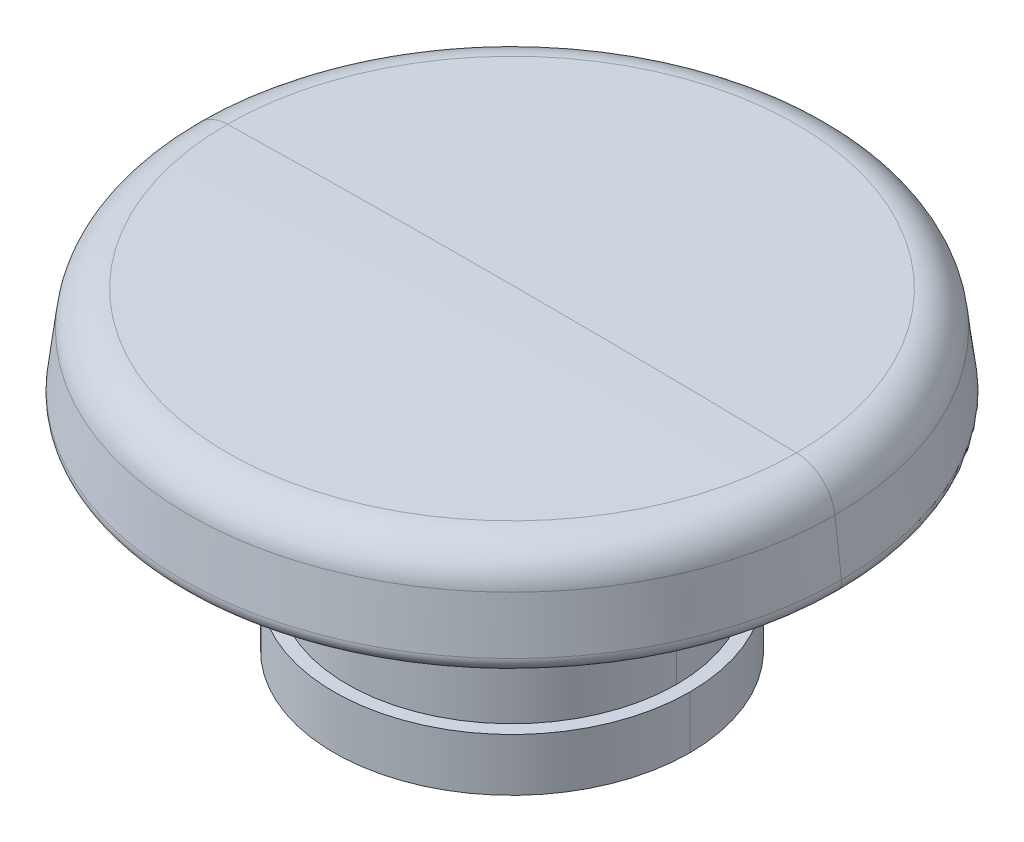
ISO-10303-21;
HEADER;
FILE_DESCRIPTION(('STEP AP214'),'2;1');
FILE_NAME('part.step','',(''),(''),'','','');
FILE_SCHEMA(('AUTOMOTIVE_DESIGN { 1 0 10303 214 1 1 1 1 }'));
ENDSEC;
DATA;
#1=APPLICATION_CONTEXT('core data for automotive mechanical design processes');
#2=APPLICATION_PROTOCOL_DEFINITION('international standard','automotive_design',2000,#1);
#3=PRODUCT_CONTEXT('',#1,'mechanical');
#4=PRODUCT('Part','Part','',(#3));
#5=PRODUCT_RELATED_PRODUCT_CATEGORY('part','',(#4));
#6=PRODUCT_DEFINITION_FORMATION('','',#4);
#7=PRODUCT_DEFINITION_CONTEXT('part definition',#1,'design');
#8=PRODUCT_DEFINITION('design','',#6,#7);
#9=PRODUCT_DEFINITION_SHAPE('','',#8);
#10=(LENGTH_UNIT() NAMED_UNIT(*) SI_UNIT(.MILLI.,.METRE.));
#11=(NAMED_UNIT(*) PLANE_ANGLE_UNIT() SI_UNIT($,.RADIAN.));
#12=(NAMED_UNIT(*) SI_UNIT($,.STERADIAN.) SOLID_ANGLE_UNIT());
#13=UNCERTAINTY_MEASURE_WITH_UNIT(LENGTH_MEASURE(1.E-05),#10,'distance_accuracy_value','');
#14=(GEOMETRIC_REPRESENTATION_CONTEXT(3) GLOBAL_UNCERTAINTY_ASSIGNED_CONTEXT((#13)) GLOBAL_UNIT_ASSIGNED_CONTEXT((#10,
#11,#12)) REPRESENTATION_CONTEXT('',''));
#15=CARTESIAN_POINT('',(0.,0.,0.));
#16=DIRECTION('',(0.,0.,1.));
#17=DIRECTION('',(1.,0.,0.));
#18=AXIS2_PLACEMENT_3D('',#15,#16,#17);
#19=CARTESIAN_POINT('',(0.,-99.2,0.));
#20=DIRECTION('',(0.,-1.,0.));
#21=DIRECTION('',(1.,0.,0.));
#22=AXIS2_PLACEMENT_3D('',#19,#20,#21);
#23=SPHERICAL_SURFACE('',#22,100.);
#24=CARTESIAN_POINT('',(0.,0.7766808870458,0.));
#25=DIRECTION('',(0.,1.,0.));
#26=DIRECTION('',(-1.,0.,0.));
#27=AXIS2_PLACEMENT_3D('',#24,#25,#26);
#28=CIRCLE('',#27,2.159462620608);
#29=CARTESIAN_POINT('',(-2.159462620608,0.7766808870458,0.));
#30=VERTEX_POINT('',#29);
#31=CARTESIAN_POINT('',(2.159462620608,0.7766808870458,0.));
#32=VERTEX_POINT('',#31);
#33=EDGE_CURVE('E231',#30,#32,#28,.T.);
#34=ORIENTED_EDGE('',*,*,#33,.T.);
#35=CARTESIAN_POINT('',(0.,-99.2,0.));
#36=DIRECTION('',(0.,0.,1.));
#37=DIRECTION('',(0.0215946262060791,0.999766808870458,0.));
#38=AXIS2_PLACEMENT_3D('',#35,#36,#37);
#39=CIRCLE('',#38,100.);
#40=CARTESIAN_POINT('',(0.,0.8,0.));
#41=VERTEX_POINT('',#40);
#42=EDGE_CURVE('E25',#32,#41,#39,.T.);
#43=ORIENTED_EDGE('',*,*,#42,.T.);
#44=CARTESIAN_POINT('',(0.,-99.2,0.));
#45=DIRECTION('',(0.,0.,-1.));
#46=DIRECTION('',(-0.0215946262060791,0.999766808870458,0.));
#47=AXIS2_PLACEMENT_3D('',#44,#45,#46);
#48=CIRCLE('',#47,100.);
#49=EDGE_CURVE('E11',#30,#41,#48,.T.);
#50=ORIENTED_EDGE('',*,*,#49,.F.);
#51=EDGE_LOOP('',(#34,#43,#50));
#52=FACE_BOUND('',#51,.T.);
#53=ADVANCED_FACE('F17',(#52),#23,.T.);
#54=CARTESIAN_POINT('',(0.,-99.2,0.));
#55=DIRECTION('',(0.,-1.,0.));
#56=DIRECTION('',(1.,0.,0.));
#57=AXIS2_PLACEMENT_3D('',#54,#55,#56);
#58=SPHERICAL_SURFACE('',#57,100.);
#59=ORIENTED_EDGE('',*,*,#42,.F.);
#60=CARTESIAN_POINT('',(0.,0.7766808870458,0.));
#61=DIRECTION('',(0.,-1.,0.));
#62=DIRECTION('',(-1.,0.,0.));
#63=AXIS2_PLACEMENT_3D('',#60,#61,#62);
#64=CIRCLE('',#63,2.159462620608);
#65=EDGE_CURVE('E180',#30,#32,#64,.T.);
#66=ORIENTED_EDGE('',*,*,#65,.F.);
#67=ORIENTED_EDGE('',*,*,#49,.T.);
#68=EDGE_LOOP('',(#59,#66,#67));
#69=FACE_BOUND('',#68,.T.);
#70=ADVANCED_FACE('F247',(#69),#58,.T.);
#71=CARTESIAN_POINT('',(0.,0.4767508443847,0.));
#72=DIRECTION('',(0.,-1.,0.));
#73=DIRECTION('',(1.,0.,0.));
#74=AXIS2_PLACEMENT_3D('',#71,#72,#73);
#75=TOROIDAL_SURFACE('',#74,2.152984232747,0.3);
#76=ORIENTED_EDGE('',*,*,#65,.T.);
#77=CARTESIAN_POINT('',(2.152984232747,0.4767508443847,0.));
#78=DIRECTION('',(0.,0.,1.));
#79=DIRECTION('',(0.992546151641328,0.121869343405103,0.));
#80=AXIS2_PLACEMENT_3D('',#77,#78,#79);
#81=CIRCLE('',#80,0.3);
#82=CARTESIAN_POINT('',(2.450748078239,0.5133116474062,0.));
#83=VERTEX_POINT('',#82);
#84=EDGE_CURVE('E227',#83,#32,#81,.T.);
#85=ORIENTED_EDGE('',*,*,#84,.F.);
#86=CARTESIAN_POINT('',(0.,0.5133116474062,0.));
#87=DIRECTION('',(0.,-1.,0.));
#88=DIRECTION('',(-1.,0.,0.));
#89=AXIS2_PLACEMENT_3D('',#86,#87,#88);
#90=CIRCLE('',#89,2.450748078239);
#91=CARTESIAN_POINT('',(-2.450748078239,0.5133116474062,0.));
#92=VERTEX_POINT('',#91);
#93=EDGE_CURVE('E217',#92,#83,#90,.T.);
#94=ORIENTED_EDGE('',*,*,#93,.F.);
#95=CARTESIAN_POINT('',(-2.152984232747,0.4767508443847,0.));
#96=DIRECTION('',(0.,0.,-1.));
#97=DIRECTION('',(-0.992546151641328,0.121869343405103,0.));
#98=AXIS2_PLACEMENT_3D('',#95,#96,#97);
#99=CIRCLE('',#98,0.3);
#100=EDGE_CURVE('E234',#92,#30,#99,.T.);
#101=ORIENTED_EDGE('',*,*,#100,.T.);
#102=EDGE_LOOP('',(#76,#85,#94,#101));
#103=FACE_BOUND('',#102,.T.);
#104=ADVANCED_FACE('F243',(#103),#75,.T.);
#105=CARTESIAN_POINT('',(0.,0.4767508443847,0.));
#106=DIRECTION('',(0.,-1.,0.));
#107=DIRECTION('',(1.,0.,0.));
#108=AXIS2_PLACEMENT_3D('',#105,#106,#107);
#109=TOROIDAL_SURFACE('',#108,2.152984232747,0.3);
#110=CARTESIAN_POINT('',(0.,0.5133116474062,0.));
#111=DIRECTION('',(0.,1.,0.));
#112=DIRECTION('',(-1.,0.,0.));
#113=AXIS2_PLACEMENT_3D('',#110,#111,#112);
#114=CIRCLE('',#113,2.450748078239);
#115=EDGE_CURVE('E212',#92,#83,#114,.T.);
#116=ORIENTED_EDGE('',*,*,#115,.T.);
#117=ORIENTED_EDGE('',*,*,#84,.T.);
#118=ORIENTED_EDGE('',*,*,#33,.F.);
#119=ORIENTED_EDGE('',*,*,#100,.F.);
#120=EDGE_LOOP('',(#116,#117,#118,#119));
#121=FACE_BOUND('',#120,.T.);
#122=ADVANCED_FACE('F246',(#121),#109,.T.);
#123=CARTESIAN_POINT('',(0.,0.3127492908734,0.));
#124=DIRECTION('',(0.,-1.,0.));
#125=DIRECTION('',(1.,0.,0.));
#126=AXIS2_PLACEMENT_3D('',#123,#124,#125);
#127=CONICAL_SURFACE('',#126,2.475374039119,0.12217304763958);
#128=CARTESIAN_POINT('',(0.,0.1121869343405,0.));
#129=DIRECTION('',(0.,1.,0.));
#130=DIRECTION('',(-1.,0.,0.));
#131=AXIS2_PLACEMENT_3D('',#128,#129,#130);
#132=CIRCLE('',#131,2.5);
#133=CARTESIAN_POINT('',(-2.5,0.1121869343405,0.));
#134=VERTEX_POINT('',#133);
#135=CARTESIAN_POINT('',(2.5,0.1121869343405,0.));
#136=VERTEX_POINT('',#135);
#137=EDGE_CURVE('E199',#134,#136,#132,.T.);
#138=ORIENTED_EDGE('',*,*,#137,.T.);
#139=DIRECTION('',(-0.121869343405103,0.992546151641327,0.));
#140=VECTOR('',#139,1.);
#141=CARTESIAN_POINT('',(2.5,0.1121869343405,0.));
#142=LINE('',#141,#140);
#143=EDGE_CURVE('E213',#136,#83,#142,.T.);
#144=ORIENTED_EDGE('',*,*,#143,.T.);
#145=ORIENTED_EDGE('',*,*,#115,.F.);
#146=DIRECTION('',(0.121869343405103,0.992546151641327,0.));
#147=VECTOR('',#146,1.);
#148=CARTESIAN_POINT('',(-2.5,0.1121869343405,0.));
#149=LINE('',#148,#147);
#150=EDGE_CURVE('E208',#134,#92,#149,.T.);
#151=ORIENTED_EDGE('',*,*,#150,.F.);
#152=EDGE_LOOP('',(#138,#144,#145,#151));
#153=FACE_BOUND('',#152,.T.);
#154=ADVANCED_FACE('F287',(#153),#127,.T.);
#155=CARTESIAN_POINT('',(0.,0.3127492908734,0.));
#156=DIRECTION('',(0.,-1.,0.));
#157=DIRECTION('',(1.,0.,0.));
#158=AXIS2_PLACEMENT_3D('',#155,#156,#157);
#159=CONICAL_SURFACE('',#158,2.475374039119,0.12217304763958);
#160=ORIENTED_EDGE('',*,*,#93,.T.);
#161=ORIENTED_EDGE('',*,*,#143,.F.);
#162=CARTESIAN_POINT('',(0.,0.1121869343405,0.));
#163=DIRECTION('',(0.,-1.,0.));
#164=DIRECTION('',(-1.,0.,0.));
#165=AXIS2_PLACEMENT_3D('',#162,#163,#164);
#166=CIRCLE('',#165,2.5);
#167=EDGE_CURVE('E207',#134,#136,#166,.T.);
#168=ORIENTED_EDGE('',*,*,#167,.F.);
#169=ORIENTED_EDGE('',*,*,#150,.T.);
#170=EDGE_LOOP('',(#160,#161,#168,#169));
#171=FACE_BOUND('',#170,.T.);
#172=ADVANCED_FACE('F265',(#171),#159,.T.);
#173=CARTESIAN_POINT('',(0.,0.1,0.));
#174=DIRECTION('',(0.,-1.,0.));
#175=DIRECTION('',(1.,0.,0.));
#176=AXIS2_PLACEMENT_3D('',#173,#174,#175);
#177=TOROIDAL_SURFACE('',#176,2.400745384836,0.1);
#178=ORIENTED_EDGE('',*,*,#167,.T.);
#179=CARTESIAN_POINT('',(2.400745384836,0.1,0.));
#180=DIRECTION('',(0.,0.,1.));
#181=DIRECTION('',(0.,-1.,0.));
#182=AXIS2_PLACEMENT_3D('',#179,#180,#181);
#183=CIRCLE('',#182,0.1);
#184=CARTESIAN_POINT('',(2.400745384836,0.,0.));
#185=VERTEX_POINT('',#184);
#186=EDGE_CURVE('E195',#185,#136,#183,.T.);
#187=ORIENTED_EDGE('',*,*,#186,.F.);
#188=CARTESIAN_POINT('',(0.,0.,0.));
#189=DIRECTION('',(0.,-1.,0.));
#190=DIRECTION('',(-1.,0.,0.));
#191=AXIS2_PLACEMENT_3D('',#188,#189,#190);
#192=CIRCLE('',#191,2.400745384836);
#193=CARTESIAN_POINT('',(-2.400745384836,0.,0.));
#194=VERTEX_POINT('',#193);
#195=EDGE_CURVE('E150',#194,#185,#192,.T.);
#196=ORIENTED_EDGE('',*,*,#195,.F.);
#197=CARTESIAN_POINT('',(-2.400745384836,0.1,0.));
#198=DIRECTION('',(0.,0.,-1.));
#199=DIRECTION('',(0.,-1.,0.));
#200=AXIS2_PLACEMENT_3D('',#197,#198,#199);
#201=CIRCLE('',#200,0.1);
#202=EDGE_CURVE('E203',#194,#134,#201,.T.);
#203=ORIENTED_EDGE('',*,*,#202,.T.);
#204=EDGE_LOOP('',(#178,#187,#196,#203));
#205=FACE_BOUND('',#204,.T.);
#206=ADVANCED_FACE('F261',(#205),#177,.T.);
#207=CARTESIAN_POINT('',(0.,0.1,0.));
#208=DIRECTION('',(0.,-1.,0.));
#209=DIRECTION('',(1.,0.,0.));
#210=AXIS2_PLACEMENT_3D('',#207,#208,#209);
#211=TOROIDAL_SURFACE('',#210,2.400745384836,0.1);
#212=CARTESIAN_POINT('',(0.,0.,0.));
#213=DIRECTION('',(0.,1.,0.));
#214=DIRECTION('',(-1.,0.,0.));
#215=AXIS2_PLACEMENT_3D('',#212,#213,#214);
#216=CIRCLE('',#215,2.400745384836);
#217=EDGE_CURVE('E154',#194,#185,#216,.T.);
#218=ORIENTED_EDGE('',*,*,#217,.T.);
#219=ORIENTED_EDGE('',*,*,#186,.T.);
#220=ORIENTED_EDGE('',*,*,#137,.F.);
#221=ORIENTED_EDGE('',*,*,#202,.F.);
#222=EDGE_LOOP('',(#218,#219,#220,#221));
#223=FACE_BOUND('',#222,.T.);
#224=ADVANCED_FACE('F257',(#223),#211,.T.);
#225=CARTESIAN_POINT('',(0.,0.,0.));
#226=DIRECTION('',(0.,-1.,0.));
#227=DIRECTION('',(0.,0.,-1.));
#228=AXIS2_PLACEMENT_3D('',#225,#226,#227);
#229=PLANE('',#228);
#230=CARTESIAN_POINT('',(0.,0.,0.));
#231=DIRECTION('',(0.,1.,0.));
#232=DIRECTION('',(-1.,0.,0.));
#233=AXIS2_PLACEMENT_3D('',#230,#231,#232);
#234=CIRCLE('',#233,1.35);
#235=CARTESIAN_POINT('',(-1.35,0.,0.));
#236=VERTEX_POINT('',#235);
#237=CARTESIAN_POINT('',(1.35,0.,0.));
#238=VERTEX_POINT('',#237);
#239=EDGE_CURVE('E148',#236,#238,#234,.T.);
#240=ORIENTED_EDGE('',*,*,#239,.T.);
#241=CARTESIAN_POINT('',(0.,0.,0.));
#242=DIRECTION('',(0.,-1.,0.));
#243=DIRECTION('',(-1.,0.,0.));
#244=AXIS2_PLACEMENT_3D('',#241,#242,#243);
#245=CIRCLE('',#244,1.35);
#246=EDGE_CURVE('E155',#236,#238,#245,.T.);
#247=ORIENTED_EDGE('',*,*,#246,.F.);
#248=EDGE_LOOP('',(#240,#247));
#249=FACE_BOUND('',#248,.T.);
#250=ORIENTED_EDGE('',*,*,#195,.T.);
#251=ORIENTED_EDGE('',*,*,#217,.F.);
#252=EDGE_LOOP('',(#250,#251));
#253=FACE_BOUND('',#252,.T.);
#254=ADVANCED_FACE('F260',(#249,#253),#229,.T.);
#255=CARTESIAN_POINT('',(0.,-0.1,0.));
#256=DIRECTION('',(0.,-1.,0.));
#257=DIRECTION('',(1.,0.,0.));
#258=AXIS2_PLACEMENT_3D('',#255,#256,#257);
#259=TOROIDAL_SURFACE('',#258,1.35,0.1);
#260=ORIENTED_EDGE('',*,*,#246,.T.);
#261=CARTESIAN_POINT('',(1.35,-0.1,0.));
#262=DIRECTION('',(0.,0.,-1.));
#263=DIRECTION('',(-1.,0.,0.));
#264=AXIS2_PLACEMENT_3D('',#261,#262,#263);
#265=CIRCLE('',#264,0.1);
#266=CARTESIAN_POINT('',(1.25,-0.1,0.));
#267=VERTEX_POINT('',#266);
#268=EDGE_CURVE('E146',#267,#238,#265,.T.);
#269=ORIENTED_EDGE('',*,*,#268,.F.);
#270=CARTESIAN_POINT('',(0.,-0.1,0.));
#271=DIRECTION('',(0.,-1.,0.));
#272=DIRECTION('',(-1.,0.,0.));
#273=AXIS2_PLACEMENT_3D('',#270,#271,#272);
#274=CIRCLE('',#273,1.25);
#275=CARTESIAN_POINT('',(-1.25,-0.1,0.));
#276=VERTEX_POINT('',#275);
#277=EDGE_CURVE('E139',#276,#267,#274,.T.);
#278=ORIENTED_EDGE('',*,*,#277,.F.);
#279=CARTESIAN_POINT('',(-1.35,-0.1,0.));
#280=DIRECTION('',(0.,0.,1.));
#281=DIRECTION('',(1.,0.,0.));
#282=AXIS2_PLACEMENT_3D('',#279,#280,#281);
#283=CIRCLE('',#282,0.1);
#284=EDGE_CURVE('E186',#276,#236,#283,.T.);
#285=ORIENTED_EDGE('',*,*,#284,.T.);
#286=EDGE_LOOP('',(#260,#269,#278,#285));
#287=FACE_BOUND('',#286,.T.);
#288=ADVANCED_FACE('F267',(#287),#259,.F.);
#289=CARTESIAN_POINT('',(0.,-0.1,0.));
#290=DIRECTION('',(0.,-1.,0.));
#291=DIRECTION('',(1.,0.,0.));
#292=AXIS2_PLACEMENT_3D('',#289,#290,#291);
#293=TOROIDAL_SURFACE('',#292,1.35,0.1);
#294=CARTESIAN_POINT('',(0.,-0.1,0.));
#295=DIRECTION('',(0.,1.,0.));
#296=DIRECTION('',(-1.,0.,0.));
#297=AXIS2_PLACEMENT_3D('',#294,#295,#296);
#298=CIRCLE('',#297,1.25);
#299=EDGE_CURVE('E136',#276,#267,#298,.T.);
#300=ORIENTED_EDGE('',*,*,#299,.T.);
#301=ORIENTED_EDGE('',*,*,#268,.T.);
#302=ORIENTED_EDGE('',*,*,#239,.F.);
#303=ORIENTED_EDGE('',*,*,#284,.F.);
#304=EDGE_LOOP('',(#300,#301,#302,#303));
#305=FACE_BOUND('',#304,.T.);
#306=ADVANCED_FACE('F270',(#305),#293,.F.);
#307=CARTESIAN_POINT('',(0.,0.9,0.));
#308=DIRECTION('',(0.,-1.,0.));
#309=DIRECTION('',(1.,0.,0.));
#310=AXIS2_PLACEMENT_3D('',#307,#308,#309);
#311=CYLINDRICAL_SURFACE('',#310,1.25);
#312=DIRECTION('',(0.,1.,0.));
#313=VECTOR('',#312,1.);
#314=CARTESIAN_POINT('',(1.25,-1.2,0.));
#315=LINE('',#314,#313);
#316=CARTESIAN_POINT('',(1.25,-1.2,0.));
#317=VERTEX_POINT('',#316);
#318=EDGE_CURVE('E129',#317,#267,#315,.T.);
#319=ORIENTED_EDGE('',*,*,#318,.T.);
#320=ORIENTED_EDGE('',*,*,#299,.F.);
#321=DIRECTION('',(0.,1.,0.));
#322=VECTOR('',#321,1.);
#323=CARTESIAN_POINT('',(-1.25,-1.2,0.));
#324=LINE('',#323,#322);
#325=CARTESIAN_POINT('',(-1.25,-1.2,0.));
#326=VERTEX_POINT('',#325);
#327=EDGE_CURVE('E128',#326,#276,#324,.T.);
#328=ORIENTED_EDGE('',*,*,#327,.F.);
#329=CARTESIAN_POINT('',(0.,-1.2,0.));
#330=DIRECTION('',(0.,-1.,0.));
#331=DIRECTION('',(1.,0.,0.));
#332=AXIS2_PLACEMENT_3D('',#329,#330,#331);
#333=CIRCLE('',#332,1.25);
#334=EDGE_CURVE('E111',#317,#326,#333,.T.);
#335=ORIENTED_EDGE('',*,*,#334,.F.);
#336=EDGE_LOOP('',(#319,#320,#328,#335));
#337=FACE_BOUND('',#336,.T.);
#338=ADVANCED_FACE('F134',(#337),#311,.T.);
#339=CARTESIAN_POINT('',(0.,-1.6,0.));
#340=DIRECTION('',(0.,-1.,0.));
#341=DIRECTION('',(0.,0.,-1.));
#342=AXIS2_PLACEMENT_3D('',#339,#340,#341);
#343=PLANE('',#342);
#344=CARTESIAN_POINT('',(0.,-1.6,0.));
#345=DIRECTION('',(0.,-1.,0.));
#346=DIRECTION('',(-1.,0.,0.));
#347=AXIS2_PLACEMENT_3D('',#344,#345,#346);
#348=CIRCLE('',#347,1.35);
#349=CARTESIAN_POINT('',(-1.35,-1.6,0.));
#350=VERTEX_POINT('',#349);
#351=CARTESIAN_POINT('',(1.35,-1.6,0.));
#352=VERTEX_POINT('',#351);
#353=EDGE_CURVE('E163',#350,#352,#348,.T.);
#354=ORIENTED_EDGE('',*,*,#353,.T.);
#355=CARTESIAN_POINT('',(0.,-1.6,0.));
#356=DIRECTION('',(0.,-1.,0.));
#357=DIRECTION('',(1.,0.,0.));
#358=AXIS2_PLACEMENT_3D('',#355,#356,#357);
#359=CIRCLE('',#358,1.35);
#360=EDGE_CURVE('E164',#352,#350,#359,.T.);
#361=ORIENTED_EDGE('',*,*,#360,.T.);
#362=EDGE_LOOP('',(#354,#361));
#363=FACE_BOUND('',#362,.T.);
#364=ADVANCED_FACE('F282',(#363),#343,.T.);
#365=CARTESIAN_POINT('',(0.,-1.2,0.));
#366=DIRECTION('',(0.,-1.,0.));
#367=DIRECTION('',(1.,0.,0.));
#368=AXIS2_PLACEMENT_3D('',#365,#366,#367);
#369=CYLINDRICAL_SURFACE('',#368,1.35);
#370=DIRECTION('',(0.,-1.,0.));
#371=VECTOR('',#370,1.);
#372=CARTESIAN_POINT('',(1.35,-1.2,0.));
#373=LINE('',#372,#371);
#374=CARTESIAN_POINT('',(1.35,-1.2,0.));
#375=VERTEX_POINT('',#374);
#376=EDGE_CURVE('E159',#375,#352,#373,.T.);
#377=ORIENTED_EDGE('',*,*,#376,.T.);
#378=ORIENTED_EDGE('',*,*,#353,.F.);
#379=DIRECTION('',(0.,-1.,0.));
#380=VECTOR('',#379,1.);
#381=CARTESIAN_POINT('',(-1.35,-1.2,0.));
#382=LINE('',#381,#380);
#383=CARTESIAN_POINT('',(-1.35,-1.2,0.));
#384=VERTEX_POINT('',#383);
#385=EDGE_CURVE('E121',#384,#350,#382,.T.);
#386=ORIENTED_EDGE('',*,*,#385,.F.);
#387=CARTESIAN_POINT('',(0.,-1.2,0.));
#388=DIRECTION('',(0.,-1.,0.));
#389=DIRECTION('',(-1.,0.,0.));
#390=AXIS2_PLACEMENT_3D('',#387,#388,#389);
#391=CIRCLE('',#390,1.35);
#392=EDGE_CURVE('E131',#384,#375,#391,.T.);
#393=ORIENTED_EDGE('',*,*,#392,.T.);
#394=EDGE_LOOP('',(#377,#378,#386,#393));
#395=FACE_BOUND('',#394,.T.);
#396=ADVANCED_FACE('F278',(#395),#369,.T.);
#397=CARTESIAN_POINT('',(0.,-1.2,0.));
#398=DIRECTION('',(0.,-1.,0.));
#399=DIRECTION('',(1.,0.,0.));
#400=AXIS2_PLACEMENT_3D('',#397,#398,#399);
#401=CYLINDRICAL_SURFACE('',#400,1.35);
#402=ORIENTED_EDGE('',*,*,#385,.T.);
#403=ORIENTED_EDGE('',*,*,#360,.F.);
#404=ORIENTED_EDGE('',*,*,#376,.F.);
#405=CARTESIAN_POINT('',(0.,-1.2,0.));
#406=DIRECTION('',(0.,-1.,0.));
#407=DIRECTION('',(1.,0.,0.));
#408=AXIS2_PLACEMENT_3D('',#405,#406,#407);
#409=CIRCLE('',#408,1.35);
#410=EDGE_CURVE('E122',#375,#384,#409,.T.);
#411=ORIENTED_EDGE('',*,*,#410,.T.);
#412=EDGE_LOOP('',(#402,#403,#404,#411));
#413=FACE_BOUND('',#412,.T.);
#414=ADVANCED_FACE('F281',(#413),#401,.T.);
#415=CARTESIAN_POINT('',(0.,-1.2,0.));
#416=DIRECTION('',(0.,-1.,0.));
#417=DIRECTION('',(0.,0.,-1.));
#418=AXIS2_PLACEMENT_3D('',#415,#416,#417);
#419=PLANE('',#418);
#420=ORIENTED_EDGE('',*,*,#334,.T.);
#421=CARTESIAN_POINT('',(0.,-1.2,0.));
#422=DIRECTION('',(0.,-1.,0.));
#423=DIRECTION('',(-1.,0.,0.));
#424=AXIS2_PLACEMENT_3D('',#421,#422,#423);
#425=CIRCLE('',#424,1.25);
#426=EDGE_CURVE('E115',#326,#317,#425,.T.);
#427=ORIENTED_EDGE('',*,*,#426,.T.);
#428=EDGE_LOOP('',(#420,#427));
#429=FACE_BOUND('',#428,.T.);
#430=ORIENTED_EDGE('',*,*,#392,.F.);
#431=ORIENTED_EDGE('',*,*,#410,.F.);
#432=EDGE_LOOP('',(#430,#431));
#433=FACE_BOUND('',#432,.T.);
#434=ADVANCED_FACE('F113',(#429,#433),#419,.F.);
#435=CARTESIAN_POINT('',(0.,0.9,0.));
#436=DIRECTION('',(0.,-1.,0.));
#437=DIRECTION('',(1.,0.,0.));
#438=AXIS2_PLACEMENT_3D('',#435,#436,#437);
#439=CYLINDRICAL_SURFACE('',#438,1.25);
#440=ORIENTED_EDGE('',*,*,#327,.T.);
#441=ORIENTED_EDGE('',*,*,#277,.T.);
#442=ORIENTED_EDGE('',*,*,#318,.F.);
#443=ORIENTED_EDGE('',*,*,#426,.F.);
#444=EDGE_LOOP('',(#440,#441,#442,#443));
#445=FACE_BOUND('',#444,.T.);
#446=ADVANCED_FACE('F126',(#445),#439,.T.);
#447=CLOSED_SHELL('',(#53,#70,#104,#122,#154,#172,#206,#224,#254,#288,#306,#338,#364,#396,#414,
#434,#446));
#448=MANIFOLD_SOLID_BREP('B1',#447);
#449=ADVANCED_BREP_SHAPE_REPRESENTATION('',(#18,#448),#14);
#450=SHAPE_DEFINITION_REPRESENTATION(#9,#449);
ENDSEC;
END-ISO-10303-21;
